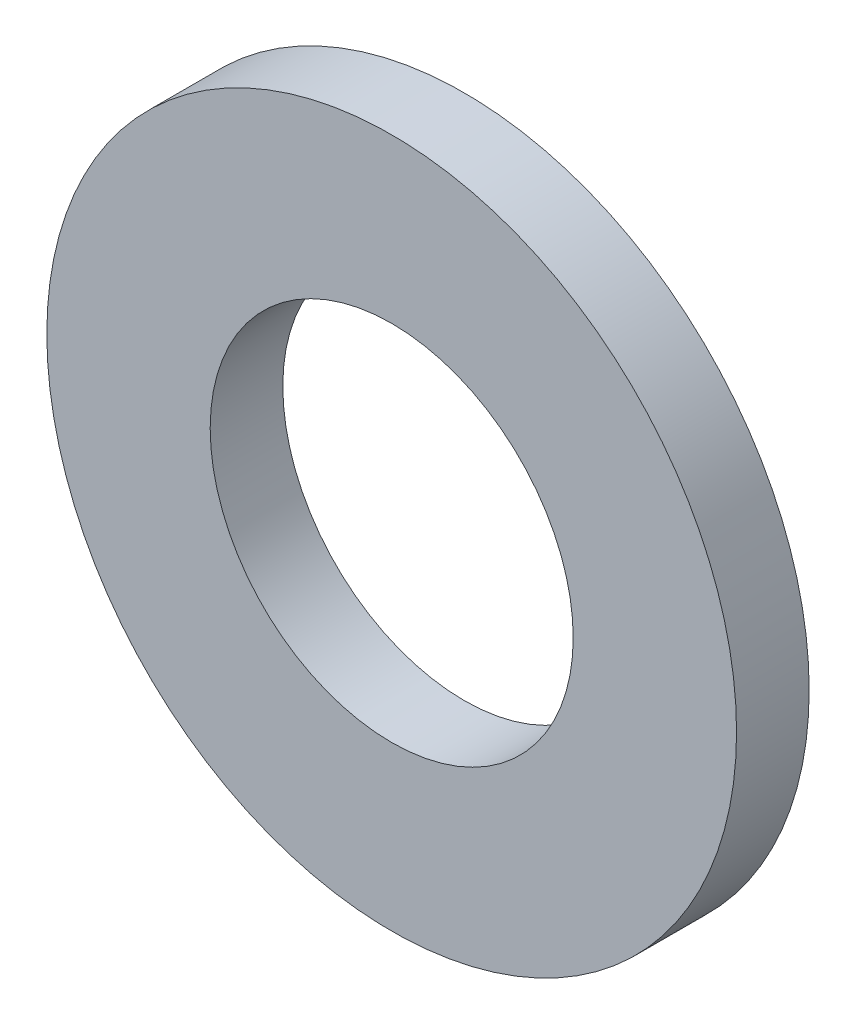
ISO-10303-21;
HEADER;
FILE_DESCRIPTION(('STEP AP214'),'2;1');
FILE_NAME('part.step','',(''),(''),'','','');
FILE_SCHEMA(('AUTOMOTIVE_DESIGN { 1 0 10303 214 1 1 1 1 }'));
ENDSEC;
DATA;
#1=APPLICATION_CONTEXT('core data for automotive mechanical design processes');
#2=APPLICATION_PROTOCOL_DEFINITION('international standard','automotive_design',2000,#1);
#3=PRODUCT_CONTEXT('',#1,'mechanical');
#4=PRODUCT('Part','Part','',(#3));
#5=PRODUCT_RELATED_PRODUCT_CATEGORY('part','',(#4));
#6=PRODUCT_DEFINITION_FORMATION('','',#4);
#7=PRODUCT_DEFINITION_CONTEXT('part definition',#1,'design');
#8=PRODUCT_DEFINITION('design','',#6,#7);
#9=PRODUCT_DEFINITION_SHAPE('','',#8);
#10=(LENGTH_UNIT() NAMED_UNIT(*) SI_UNIT(.MILLI.,.METRE.));
#11=(NAMED_UNIT(*) PLANE_ANGLE_UNIT() SI_UNIT($,.RADIAN.));
#12=(NAMED_UNIT(*) SI_UNIT($,.STERADIAN.) SOLID_ANGLE_UNIT());
#13=UNCERTAINTY_MEASURE_WITH_UNIT(LENGTH_MEASURE(1.E-05),#10,'distance_accuracy_value','');
#14=(GEOMETRIC_REPRESENTATION_CONTEXT(3) GLOBAL_UNCERTAINTY_ASSIGNED_CONTEXT((#13)) GLOBAL_UNIT_ASSIGNED_CONTEXT((#10,
#11,#12)) REPRESENTATION_CONTEXT('',''));
#15=CARTESIAN_POINT('',(0.,0.,0.));
#16=DIRECTION('',(0.,0.,1.));
#17=DIRECTION('',(1.,0.,0.));
#18=AXIS2_PLACEMENT_3D('',#15,#16,#17);
#19=CARTESIAN_POINT('',(0.,0.,3.));
#20=DIRECTION('',(0.,0.,1.));
#21=DIRECTION('',(1.,0.,0.));
#22=AXIS2_PLACEMENT_3D('',#19,#20,#21);
#23=PLANE('',#22);
#24=CARTESIAN_POINT('',(0.,0.,3.));
#25=DIRECTION('',(0.,0.,1.));
#26=DIRECTION('',(1.,0.,0.));
#27=AXIS2_PLACEMENT_3D('',#24,#25,#26);
#28=CIRCLE('',#27,28.5);
#29=CARTESIAN_POINT('',(28.5,0.,3.));
#30=VERTEX_POINT('',#29);
#31=EDGE_CURVE('E10',#30,#30,#28,.T.);
#32=ORIENTED_EDGE('',*,*,#31,.T.);
#33=EDGE_LOOP('',(#32));
#34=FACE_BOUND('',#33,.T.);
#35=CARTESIAN_POINT('',(0.,0.,3.));
#36=DIRECTION('',(0.,0.,1.));
#37=DIRECTION('',(1.,0.,0.));
#38=AXIS2_PLACEMENT_3D('',#35,#36,#37);
#39=CIRCLE('',#38,15.);
#40=CARTESIAN_POINT('',(15.,0.,3.));
#41=VERTEX_POINT('',#40);
#42=EDGE_CURVE('E35',#41,#41,#39,.T.);
#43=ORIENTED_EDGE('',*,*,#42,.F.);
#44=EDGE_LOOP('',(#43));
#45=FACE_BOUND('',#44,.T.);
#46=ADVANCED_FACE('F28',(#34,#45),#23,.T.);
#47=CARTESIAN_POINT('',(0.,0.,3.));
#48=DIRECTION('',(0.,0.,-1.));
#49=DIRECTION('',(-1.,0.,0.));
#50=AXIS2_PLACEMENT_3D('',#47,#48,#49);
#51=CYLINDRICAL_SURFACE('',#50,28.5);
#52=ORIENTED_EDGE('',*,*,#31,.F.);
#53=EDGE_LOOP('',(#52));
#54=FACE_BOUND('',#53,.T.);
#55=CARTESIAN_POINT('',(0.,0.,-3.));
#56=DIRECTION('',(0.,0.,1.));
#57=DIRECTION('',(1.,0.,0.));
#58=AXIS2_PLACEMENT_3D('',#55,#56,#57);
#59=CIRCLE('',#58,28.5);
#60=CARTESIAN_POINT('',(28.5,0.,-3.));
#61=VERTEX_POINT('',#60);
#62=EDGE_CURVE('E39',#61,#61,#59,.T.);
#63=ORIENTED_EDGE('',*,*,#62,.T.);
#64=EDGE_LOOP('',(#63));
#65=FACE_BOUND('',#64,.T.);
#66=ADVANCED_FACE('F30',(#54,#65),#51,.T.);
#67=CARTESIAN_POINT('',(0.,0.,3.));
#68=DIRECTION('',(0.,0.,-1.));
#69=DIRECTION('',(-1.,0.,0.));
#70=AXIS2_PLACEMENT_3D('',#67,#68,#69);
#71=CYLINDRICAL_SURFACE('',#70,15.);
#72=ORIENTED_EDGE('',*,*,#42,.T.);
#73=EDGE_LOOP('',(#72));
#74=FACE_BOUND('',#73,.T.);
#75=CARTESIAN_POINT('',(0.,0.,-3.));
#76=DIRECTION('',(0.,0.,1.));
#77=DIRECTION('',(1.,0.,0.));
#78=AXIS2_PLACEMENT_3D('',#75,#76,#77);
#79=CIRCLE('',#78,15.);
#80=CARTESIAN_POINT('',(15.,0.,-3.));
#81=VERTEX_POINT('',#80);
#82=EDGE_CURVE('E43',#81,#81,#79,.T.);
#83=ORIENTED_EDGE('',*,*,#82,.F.);
#84=EDGE_LOOP('',(#83));
#85=FACE_BOUND('',#84,.T.);
#86=ADVANCED_FACE('F52',(#74,#85),#71,.F.);
#87=CARTESIAN_POINT('',(0.,0.,-3.));
#88=DIRECTION('',(0.,0.,1.));
#89=DIRECTION('',(1.,0.,0.));
#90=AXIS2_PLACEMENT_3D('',#87,#88,#89);
#91=PLANE('',#90);
#92=ORIENTED_EDGE('',*,*,#82,.T.);
#93=EDGE_LOOP('',(#92));
#94=FACE_BOUND('',#93,.T.);
#95=ORIENTED_EDGE('',*,*,#62,.F.);
#96=EDGE_LOOP('',(#95));
#97=FACE_BOUND('',#96,.T.);
#98=ADVANCED_FACE('F49',(#94,#97),#91,.F.);
#99=CLOSED_SHELL('',(#46,#66,#86,#98));
#100=MANIFOLD_SOLID_BREP('B2',#99);
#101=ADVANCED_BREP_SHAPE_REPRESENTATION('',(#18,#100),#14);
#102=SHAPE_DEFINITION_REPRESENTATION(#9,#101);
ENDSEC;
END-ISO-10303-21;
